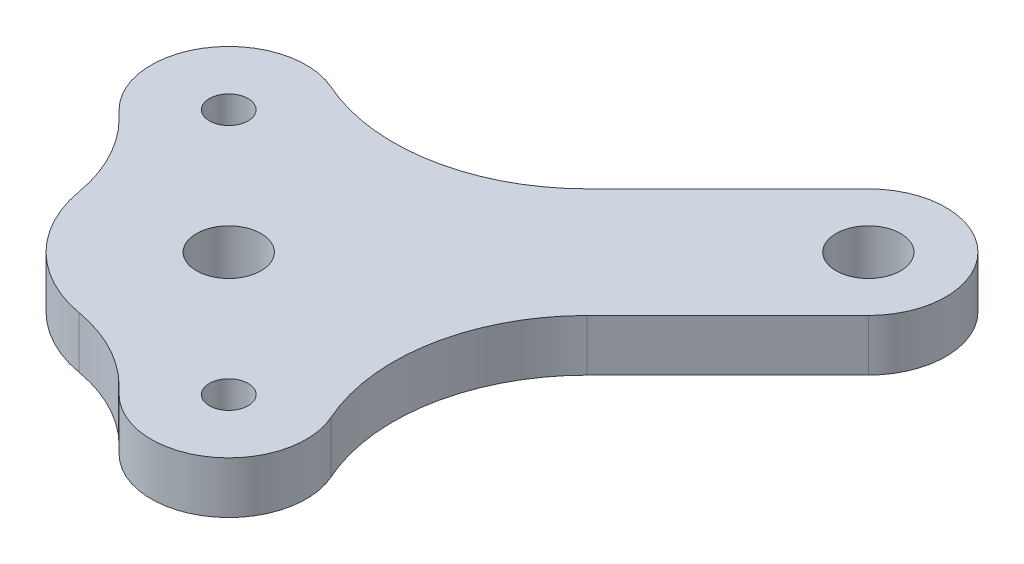
ISO-10303-21;
HEADER;
FILE_DESCRIPTION(('STEP AP214'),'2;1');
FILE_NAME('part.step','',(''),(''),'','','');
FILE_SCHEMA(('AUTOMOTIVE_DESIGN { 1 0 10303 214 1 1 1 1 }'));
ENDSEC;
DATA;
#1=APPLICATION_CONTEXT('core data for automotive mechanical design processes');
#2=APPLICATION_PROTOCOL_DEFINITION('international standard','automotive_design',2000,#1);
#3=PRODUCT_CONTEXT('',#1,'mechanical');
#4=PRODUCT('Part','Part','',(#3));
#5=PRODUCT_RELATED_PRODUCT_CATEGORY('part','',(#4));
#6=PRODUCT_DEFINITION_FORMATION('','',#4);
#7=PRODUCT_DEFINITION_CONTEXT('part definition',#1,'design');
#8=PRODUCT_DEFINITION('design','',#6,#7);
#9=PRODUCT_DEFINITION_SHAPE('','',#8);
#10=(LENGTH_UNIT() NAMED_UNIT(*) SI_UNIT(.MILLI.,.METRE.));
#11=(NAMED_UNIT(*) PLANE_ANGLE_UNIT() SI_UNIT($,.RADIAN.));
#12=(NAMED_UNIT(*) SI_UNIT($,.STERADIAN.) SOLID_ANGLE_UNIT());
#13=UNCERTAINTY_MEASURE_WITH_UNIT(LENGTH_MEASURE(1.E-05),#10,'distance_accuracy_value','');
#14=(GEOMETRIC_REPRESENTATION_CONTEXT(3) GLOBAL_UNCERTAINTY_ASSIGNED_CONTEXT((#13)) GLOBAL_UNIT_ASSIGNED_CONTEXT((#10,
#11,#12)) REPRESENTATION_CONTEXT('',''));
#15=CARTESIAN_POINT('',(0.,0.,0.));
#16=DIRECTION('',(0.,0.,1.));
#17=DIRECTION('',(1.,0.,0.));
#18=AXIS2_PLACEMENT_3D('',#15,#16,#17);
#19=CARTESIAN_POINT('',(17.9540584539815,31.5,60.4540584539817));
#20=DIRECTION('',(0.,1.,0.));
#21=DIRECTION('',(0.,0.,1.));
#22=AXIS2_PLACEMENT_3D('',#19,#20,#21);
#23=PLANE('',#22);
#24=CARTESIAN_POINT('',(52.248737341529,31.5,45.2512626584706));
#25=DIRECTION('',(0.,1.,0.));
#26=DIRECTION('',(0.,0.,1.));
#27=AXIS2_PLACEMENT_3D('',#24,#25,#26);
#28=CIRCLE('',#27,2.5);
#29=CARTESIAN_POINT('',(52.248737341529,31.5,47.7512626584706));
#30=VERTEX_POINT('',#29);
#31=EDGE_CURVE('E422',#30,#30,#28,.T.);
#32=ORIENTED_EDGE('',*,*,#31,.F.);
#33=EDGE_LOOP('',(#32));
#34=FACE_BOUND('',#33,.T.);
#35=CARTESIAN_POINT('',(17.9540584539815,31.5,60.4540584539817));
#36=DIRECTION('',(0.,1.,0.));
#37=DIRECTION('',(0.,0.,1.));
#38=AXIS2_PLACEMENT_3D('',#35,#36,#37);
#39=CIRCLE('',#38,1.49999999999998);
#40=CARTESIAN_POINT('',(17.9540584539815,31.5,61.9540584539817));
#41=VERTEX_POINT('',#40);
#42=EDGE_CURVE('E202',#41,#41,#39,.T.);
#43=ORIENTED_EDGE('',*,*,#42,.F.);
#44=EDGE_LOOP('',(#43));
#45=FACE_BOUND('',#44,.T.);
#46=CARTESIAN_POINT('',(17.9540584539815,31.5,60.4540584539817));
#47=DIRECTION('',(0.,1.,0.));
#48=DIRECTION('',(0.,0.,1.));
#49=AXIS2_PLACEMENT_3D('',#46,#47,#48);
#50=CIRCLE('',#49,6.00000000000009);
#51=CARTESIAN_POINT('',(20.4016672104904,31.5,54.9759920638161));
#52=VERTEX_POINT('',#51);
#53=CARTESIAN_POINT('',(13.7114177668622,31.5,64.6966991411011));
#54=VERTEX_POINT('',#53);
#55=EDGE_CURVE('E134',#52,#54,#50,.T.);
#56=ORIENTED_EDGE('',*,*,#55,.T.);
#57=DIRECTION('',(0.707106781186554,0.,0.707106781186541));
#58=VECTOR('',#57,1.);
#59=CARTESIAN_POINT('',(13.7114177668622,31.5,64.6966991411011));
#60=LINE('',#59,#58);
#61=CARTESIAN_POINT('',(14.3130874028816,31.5,65.2983687771204));
#62=VERTEX_POINT('',#61);
#63=EDGE_CURVE('E123',#54,#62,#60,.T.);
#64=ORIENTED_EDGE('',*,*,#63,.T.);
#65=CARTESIAN_POINT('',(5.82780602864306,31.5,73.7836501513591));
#66=DIRECTION('',(0.,1.,0.));
#67=DIRECTION('',(0.,0.,1.));
#68=AXIS2_PLACEMENT_3D('',#65,#66,#67);
#69=CIRCLE('',#68,12.);
#70=CARTESIAN_POINT('',(17.6490027402923,31.5,71.7198409778905));
#71=VERTEX_POINT('',#70);
#72=EDGE_CURVE('E165',#62,#71,#69,.F.);
#73=ORIENTED_EDGE('',*,*,#72,.T.);
#74=CARTESIAN_POINT('',(27.5,31.5,70.));
#75=DIRECTION('',(0.,1.,0.));
#76=DIRECTION('',(0.,0.,1.));
#77=AXIS2_PLACEMENT_3D('',#74,#75,#76);
#78=CIRCLE('',#77,9.99999999999999);
#79=CARTESIAN_POINT('',(25.7801590221097,31.5,79.8509972597077));
#80=VERTEX_POINT('',#79);
#81=EDGE_CURVE('E133',#71,#80,#78,.T.);
#82=ORIENTED_EDGE('',*,*,#81,.T.);
#83=CARTESIAN_POINT('',(23.7163498486414,31.5,91.672193971357));
#84=DIRECTION('',(0.,1.,0.));
#85=DIRECTION('',(0.,0.,1.));
#86=AXIS2_PLACEMENT_3D('',#83,#84,#85);
#87=CIRCLE('',#86,12.);
#88=CARTESIAN_POINT('',(32.2016312228799,31.5,83.1869125971184));
#89=VERTEX_POINT('',#88);
#90=EDGE_CURVE('E11',#80,#89,#87,.F.);
#91=ORIENTED_EDGE('',*,*,#90,.T.);
#92=DIRECTION('',(0.707106781186554,0.,0.707106781186541));
#93=VECTOR('',#92,1.);
#94=CARTESIAN_POINT('',(28.9142135623731,31.5,79.8994949366117));
#95=LINE('',#94,#93);
#96=CARTESIAN_POINT('',(32.8033008588992,31.5,83.7885822331377));
#97=VERTEX_POINT('',#96);
#98=EDGE_CURVE('E184',#89,#97,#95,.T.);
#99=ORIENTED_EDGE('',*,*,#98,.T.);
#100=CARTESIAN_POINT('',(37.0459415460185,31.5,79.5459415460183));
#101=DIRECTION('',(0.,1.,0.));
#102=DIRECTION('',(0.,0.,-1.));
#103=AXIS2_PLACEMENT_3D('',#100,#101,#102);
#104=CIRCLE('',#103,6.00000000000009);
#105=CARTESIAN_POINT('',(42.5240079361841,31.5,77.0983327895093));
#106=VERTEX_POINT('',#105);
#107=EDGE_CURVE('E186',#97,#106,#104,.T.);
#108=ORIENTED_EDGE('',*,*,#107,.T.);
#109=CARTESIAN_POINT('',(56.2191739115978,31.5,70.979310898237));
#110=DIRECTION('',(0.,-1.,0.));
#111=DIRECTION('',(0.,0.,-1.));
#112=AXIS2_PLACEMENT_3D('',#109,#110,#111);
#113=CIRCLE('',#112,15.);
#114=CARTESIAN_POINT('',(45.6125721937995,31.5,60.3727091804389));
#115=VERTEX_POINT('',#114);
#116=EDGE_CURVE('E188',#106,#115,#113,.T.);
#117=ORIENTED_EDGE('',*,*,#116,.T.);
#118=DIRECTION('',(0.707106781186541,0.,-0.707106781186554));
#119=VECTOR('',#118,1.);
#120=CARTESIAN_POINT('',(56.4913780286483,31.5,49.4939033455898));
#121=LINE('',#120,#119);
#122=CARTESIAN_POINT('',(56.4913780286483,31.5,49.4939033455898));
#123=VERTEX_POINT('',#122);
#124=EDGE_CURVE('E193',#115,#123,#121,.T.);
#125=ORIENTED_EDGE('',*,*,#124,.T.);
#126=CARTESIAN_POINT('',(52.248737341529,31.5,45.2512626584706));
#127=DIRECTION('',(0.,1.,0.));
#128=DIRECTION('',(0.,0.,1.));
#129=AXIS2_PLACEMENT_3D('',#126,#127,#128);
#130=CIRCLE('',#129,6.);
#131=CARTESIAN_POINT('',(48.0060966544097,31.5,41.0086219713513));
#132=VERTEX_POINT('',#131);
#133=EDGE_CURVE('E195',#123,#132,#130,.T.);
#134=ORIENTED_EDGE('',*,*,#133,.T.);
#135=DIRECTION('',(-0.707106781186541,0.,0.707106781186554));
#136=VECTOR('',#135,1.);
#137=CARTESIAN_POINT('',(48.0060966544097,31.5,41.0086219713513));
#138=LINE('',#137,#136);
#139=CARTESIAN_POINT('',(37.1272908195608,31.5,51.8874278062004));
#140=VERTEX_POINT('',#139);
#141=EDGE_CURVE('E197',#132,#140,#138,.T.);
#142=ORIENTED_EDGE('',*,*,#141,.T.);
#143=CARTESIAN_POINT('',(26.5206891017625,31.5,41.2808260884022));
#144=DIRECTION('',(0.,-1.,0.));
#145=DIRECTION('',(0.,0.,1.));
#146=AXIS2_PLACEMENT_3D('',#143,#144,#145);
#147=CIRCLE('',#146,15.);
#148=EDGE_CURVE('E139',#140,#52,#147,.T.);
#149=ORIENTED_EDGE('',*,*,#148,.T.);
#150=EDGE_LOOP('',(#56,#64,#73,#82,#91,#99,#108,#117,#125,#134,#142,#149));
#151=FACE_BOUND('',#150,.T.);
#152=CARTESIAN_POINT('',(27.5,31.5,70.));
#153=DIRECTION('',(0.,1.,0.));
#154=DIRECTION('',(0.,0.,1.));
#155=AXIS2_PLACEMENT_3D('',#152,#153,#154);
#156=CIRCLE('',#155,2.5);
#157=CARTESIAN_POINT('',(27.5,31.5,72.5));
#158=VERTEX_POINT('',#157);
#159=EDGE_CURVE('E428',#158,#158,#156,.T.);
#160=ORIENTED_EDGE('',*,*,#159,.F.);
#161=EDGE_LOOP('',(#160));
#162=FACE_BOUND('',#161,.T.);
#163=CARTESIAN_POINT('',(37.0459415460185,31.5,79.5459415460183));
#164=DIRECTION('',(0.,1.,0.));
#165=DIRECTION('',(0.,0.,-1.));
#166=AXIS2_PLACEMENT_3D('',#163,#164,#165);
#167=CIRCLE('',#166,1.5);
#168=CARTESIAN_POINT('',(37.0459415460185,31.5,78.0459415460183));
#169=VERTEX_POINT('',#168);
#170=EDGE_CURVE('E413',#169,#169,#167,.T.);
#171=ORIENTED_EDGE('',*,*,#170,.F.);
#172=EDGE_LOOP('',(#171));
#173=FACE_BOUND('',#172,.T.);
#174=ADVANCED_FACE('F35',(#34,#45,#151,#162,#173),#23,.T.);
#175=CARTESIAN_POINT('',(17.9540584539815,27.5,60.4540584539817));
#176=DIRECTION('',(0.,1.,0.));
#177=DIRECTION('',(0.,0.,1.));
#178=AXIS2_PLACEMENT_3D('',#175,#176,#177);
#179=PLANE('',#178);
#180=CARTESIAN_POINT('',(17.9540584539815,27.5,60.4540584539817));
#181=DIRECTION('',(0.,1.,0.));
#182=DIRECTION('',(0.,0.,1.));
#183=AXIS2_PLACEMENT_3D('',#180,#181,#182);
#184=CIRCLE('',#183,6.00000000000009);
#185=CARTESIAN_POINT('',(20.4016672104904,27.5,54.9759920638161));
#186=VERTEX_POINT('',#185);
#187=CARTESIAN_POINT('',(13.7114177668622,27.5,64.6966991411011));
#188=VERTEX_POINT('',#187);
#189=EDGE_CURVE('E147',#186,#188,#184,.T.);
#190=ORIENTED_EDGE('',*,*,#189,.F.);
#191=CARTESIAN_POINT('',(26.5206891017625,27.5,41.2808260884022));
#192=DIRECTION('',(0.,-1.,0.));
#193=DIRECTION('',(0.,0.,1.));
#194=AXIS2_PLACEMENT_3D('',#191,#192,#193);
#195=CIRCLE('',#194,15.);
#196=CARTESIAN_POINT('',(37.1272908195608,27.5,51.8874278062004));
#197=VERTEX_POINT('',#196);
#198=EDGE_CURVE('E143',#197,#186,#195,.T.);
#199=ORIENTED_EDGE('',*,*,#198,.F.);
#200=DIRECTION('',(-0.707106781186541,0.,0.707106781186554));
#201=VECTOR('',#200,1.);
#202=CARTESIAN_POINT('',(48.0060966544097,27.5,41.0086219713513));
#203=LINE('',#202,#201);
#204=CARTESIAN_POINT('',(48.0060966544097,27.5,41.0086219713513));
#205=VERTEX_POINT('',#204);
#206=EDGE_CURVE('E213',#205,#197,#203,.T.);
#207=ORIENTED_EDGE('',*,*,#206,.F.);
#208=CARTESIAN_POINT('',(52.248737341529,27.5,45.2512626584706));
#209=DIRECTION('',(0.,1.,0.));
#210=DIRECTION('',(0.,0.,1.));
#211=AXIS2_PLACEMENT_3D('',#208,#209,#210);
#212=CIRCLE('',#211,6.);
#213=CARTESIAN_POINT('',(56.4913780286483,27.5,49.4939033455898));
#214=VERTEX_POINT('',#213);
#215=EDGE_CURVE('E211',#214,#205,#212,.T.);
#216=ORIENTED_EDGE('',*,*,#215,.F.);
#217=DIRECTION('',(0.707106781186541,0.,-0.707106781186554));
#218=VECTOR('',#217,1.);
#219=CARTESIAN_POINT('',(56.4913780286483,27.5,49.4939033455898));
#220=LINE('',#219,#218);
#221=CARTESIAN_POINT('',(45.6125721937995,27.5,60.3727091804389));
#222=VERTEX_POINT('',#221);
#223=EDGE_CURVE('E209',#222,#214,#220,.T.);
#224=ORIENTED_EDGE('',*,*,#223,.F.);
#225=CARTESIAN_POINT('',(56.2191739115978,27.5,70.979310898237));
#226=DIRECTION('',(0.,-1.,0.));
#227=DIRECTION('',(0.,0.,-1.));
#228=AXIS2_PLACEMENT_3D('',#225,#226,#227);
#229=CIRCLE('',#228,15.);
#230=CARTESIAN_POINT('',(42.5240079361841,27.5,77.0983327895093));
#231=VERTEX_POINT('',#230);
#232=EDGE_CURVE('E207',#231,#222,#229,.T.);
#233=ORIENTED_EDGE('',*,*,#232,.F.);
#234=CARTESIAN_POINT('',(37.0459415460185,27.5,79.5459415460183));
#235=DIRECTION('',(0.,1.,0.));
#236=DIRECTION('',(0.,0.,-1.));
#237=AXIS2_PLACEMENT_3D('',#234,#235,#236);
#238=CIRCLE('',#237,6.00000000000009);
#239=CARTESIAN_POINT('',(32.8033008588992,27.5,83.7885822331377));
#240=VERTEX_POINT('',#239);
#241=EDGE_CURVE('E205',#240,#231,#238,.T.);
#242=ORIENTED_EDGE('',*,*,#241,.F.);
#243=DIRECTION('',(0.707106781186554,0.,0.707106781186541));
#244=VECTOR('',#243,1.);
#245=CARTESIAN_POINT('',(28.9142135623731,27.5,79.8994949366117));
#246=LINE('',#245,#244);
#247=CARTESIAN_POINT('',(32.2016312228799,27.5,83.1869125971184));
#248=VERTEX_POINT('',#247);
#249=EDGE_CURVE('E174',#248,#240,#246,.T.);
#250=ORIENTED_EDGE('',*,*,#249,.F.);
#251=CARTESIAN_POINT('',(23.7163498486414,27.5,91.672193971357));
#252=DIRECTION('',(0.,1.,0.));
#253=DIRECTION('',(0.,0.,1.));
#254=AXIS2_PLACEMENT_3D('',#251,#252,#253);
#255=CIRCLE('',#254,12.);
#256=CARTESIAN_POINT('',(25.7801590221097,27.5,79.8509972597077));
#257=VERTEX_POINT('',#256);
#258=EDGE_CURVE('E43',#248,#257,#255,.T.);
#259=ORIENTED_EDGE('',*,*,#258,.T.);
#260=CARTESIAN_POINT('',(27.5,27.5,70.));
#261=DIRECTION('',(0.,1.,0.));
#262=DIRECTION('',(0.,0.,1.));
#263=AXIS2_PLACEMENT_3D('',#260,#261,#262);
#264=CIRCLE('',#263,9.99999999999999);
#265=CARTESIAN_POINT('',(17.6490027402923,27.5,71.7198409778905));
#266=VERTEX_POINT('',#265);
#267=EDGE_CURVE('E172',#266,#257,#264,.T.);
#268=ORIENTED_EDGE('',*,*,#267,.F.);
#269=CARTESIAN_POINT('',(5.82780602864306,27.5,73.7836501513591));
#270=DIRECTION('',(0.,1.,0.));
#271=DIRECTION('',(0.,0.,1.));
#272=AXIS2_PLACEMENT_3D('',#269,#270,#271);
#273=CIRCLE('',#272,12.);
#274=CARTESIAN_POINT('',(14.3130874028816,27.5,65.2983687771204));
#275=VERTEX_POINT('',#274);
#276=EDGE_CURVE('E163',#266,#275,#273,.T.);
#277=ORIENTED_EDGE('',*,*,#276,.T.);
#278=DIRECTION('',(0.707106781186554,0.,0.707106781186541));
#279=VECTOR('',#278,1.);
#280=CARTESIAN_POINT('',(13.7114177668622,27.5,64.6966991411011));
#281=LINE('',#280,#279);
#282=EDGE_CURVE('E179',#188,#275,#281,.T.);
#283=ORIENTED_EDGE('',*,*,#282,.F.);
#284=EDGE_LOOP('',(#190,#199,#207,#216,#224,#233,#242,#250,#259,#268,#277,#283));
#285=FACE_BOUND('',#284,.T.);
#286=CARTESIAN_POINT('',(17.9540584539815,27.5,60.4540584539817));
#287=DIRECTION('',(0.,1.,0.));
#288=DIRECTION('',(0.,0.,1.));
#289=AXIS2_PLACEMENT_3D('',#286,#287,#288);
#290=CIRCLE('',#289,1.49999999999998);
#291=CARTESIAN_POINT('',(17.9540584539815,27.5,61.9540584539817));
#292=VERTEX_POINT('',#291);
#293=EDGE_CURVE('E431',#292,#292,#290,.T.);
#294=ORIENTED_EDGE('',*,*,#293,.T.);
#295=EDGE_LOOP('',(#294));
#296=FACE_BOUND('',#295,.T.);
#297=CARTESIAN_POINT('',(27.5,27.5,70.));
#298=DIRECTION('',(0.,1.,0.));
#299=DIRECTION('',(0.,0.,1.));
#300=AXIS2_PLACEMENT_3D('',#297,#298,#299);
#301=CIRCLE('',#300,2.5);
#302=CARTESIAN_POINT('',(27.5,27.5,72.5));
#303=VERTEX_POINT('',#302);
#304=EDGE_CURVE('E425',#303,#303,#301,.T.);
#305=ORIENTED_EDGE('',*,*,#304,.T.);
#306=EDGE_LOOP('',(#305));
#307=FACE_BOUND('',#306,.T.);
#308=CARTESIAN_POINT('',(52.248737341529,27.5,45.2512626584706));
#309=DIRECTION('',(0.,1.,0.));
#310=DIRECTION('',(0.,0.,1.));
#311=AXIS2_PLACEMENT_3D('',#308,#309,#310);
#312=CIRCLE('',#311,2.5);
#313=CARTESIAN_POINT('',(52.248737341529,27.5,47.7512626584706));
#314=VERTEX_POINT('',#313);
#315=EDGE_CURVE('E419',#314,#314,#312,.T.);
#316=ORIENTED_EDGE('',*,*,#315,.T.);
#317=EDGE_LOOP('',(#316));
#318=FACE_BOUND('',#317,.T.);
#319=CARTESIAN_POINT('',(37.0459415460185,27.5,79.5459415460183));
#320=DIRECTION('',(0.,1.,0.));
#321=DIRECTION('',(0.,0.,-1.));
#322=AXIS2_PLACEMENT_3D('',#319,#320,#321);
#323=CIRCLE('',#322,1.5);
#324=CARTESIAN_POINT('',(37.0459415460185,27.5,78.0459415460183));
#325=VERTEX_POINT('',#324);
#326=EDGE_CURVE('E416',#325,#325,#323,.T.);
#327=ORIENTED_EDGE('',*,*,#326,.T.);
#328=EDGE_LOOP('',(#327));
#329=FACE_BOUND('',#328,.T.);
#330=ADVANCED_FACE('F170',(#285,#296,#307,#318,#329),#179,.F.);
#331=CARTESIAN_POINT('',(17.9540584539815,31.5,60.4540584539817));
#332=DIRECTION('',(0.,-1.,0.));
#333=DIRECTION('',(0.,0.,-1.));
#334=AXIS2_PLACEMENT_3D('',#331,#332,#333);
#335=CYLINDRICAL_SURFACE('',#334,6.00000000000009);
#336=ORIENTED_EDGE('',*,*,#189,.T.);
#337=DIRECTION('',(0.,-1.,0.));
#338=VECTOR('',#337,1.);
#339=CARTESIAN_POINT('',(13.7114177668622,31.5,64.6966991411011));
#340=LINE('',#339,#338);
#341=EDGE_CURVE('E128',#54,#188,#340,.T.);
#342=ORIENTED_EDGE('',*,*,#341,.F.);
#343=ORIENTED_EDGE('',*,*,#55,.F.);
#344=DIRECTION('',(0.,-1.,0.));
#345=VECTOR('',#344,1.);
#346=CARTESIAN_POINT('',(20.4016672104904,31.5,54.9759920638161));
#347=LINE('',#346,#345);
#348=EDGE_CURVE('E200',#52,#186,#347,.T.);
#349=ORIENTED_EDGE('',*,*,#348,.T.);
#350=EDGE_LOOP('',(#336,#342,#343,#349));
#351=FACE_BOUND('',#350,.T.);
#352=ADVANCED_FACE('F145',(#351),#335,.T.);
#353=CARTESIAN_POINT('',(13.7114177668622,31.5,64.6966991411011));
#354=DIRECTION('',(0.707106781186541,0.,-0.707106781186554));
#355=DIRECTION('',(-0.707106781186554,0.,-0.707106781186541));
#356=AXIS2_PLACEMENT_3D('',#353,#354,#355);
#357=PLANE('',#356);
#358=ORIENTED_EDGE('',*,*,#282,.T.);
#359=DIRECTION('',(0.,1.,0.));
#360=VECTOR('',#359,1.);
#361=CARTESIAN_POINT('',(14.3130874028816,31.5,65.2983687771204));
#362=LINE('',#361,#360);
#363=EDGE_CURVE('E131',#275,#62,#362,.T.);
#364=ORIENTED_EDGE('',*,*,#363,.T.);
#365=ORIENTED_EDGE('',*,*,#63,.F.);
#366=ORIENTED_EDGE('',*,*,#341,.T.);
#367=EDGE_LOOP('',(#358,#364,#365,#366));
#368=FACE_BOUND('',#367,.T.);
#369=ADVANCED_FACE('F126',(#368),#357,.F.);
#370=CARTESIAN_POINT('',(27.5,31.5,70.));
#371=DIRECTION('',(0.,-1.,0.));
#372=DIRECTION('',(0.,0.,-1.));
#373=AXIS2_PLACEMENT_3D('',#370,#371,#372);
#374=CYLINDRICAL_SURFACE('',#373,9.99999999999999);
#375=ORIENTED_EDGE('',*,*,#81,.F.);
#376=DIRECTION('',(0.,-1.,0.));
#377=VECTOR('',#376,1.);
#378=CARTESIAN_POINT('',(17.6490027402923,31.5,71.7198409778905));
#379=LINE('',#378,#377);
#380=EDGE_CURVE('E151',#71,#266,#379,.T.);
#381=ORIENTED_EDGE('',*,*,#380,.T.);
#382=ORIENTED_EDGE('',*,*,#267,.T.);
#383=DIRECTION('',(0.,-1.,0.));
#384=VECTOR('',#383,1.);
#385=CARTESIAN_POINT('',(25.7801590221097,31.5,79.8509972597077));
#386=LINE('',#385,#384);
#387=EDGE_CURVE('E148',#257,#80,#386,.F.);
#388=ORIENTED_EDGE('',*,*,#387,.T.);
#389=EDGE_LOOP('',(#375,#381,#382,#388));
#390=FACE_BOUND('',#389,.T.);
#391=ADVANCED_FACE('F177',(#390),#374,.T.);
#392=CARTESIAN_POINT('',(28.9142135623731,31.5,79.8994949366117));
#393=DIRECTION('',(0.707106781186541,0.,-0.707106781186554));
#394=DIRECTION('',(-0.707106781186554,0.,-0.707106781186541));
#395=AXIS2_PLACEMENT_3D('',#392,#393,#394);
#396=PLANE('',#395);
#397=ORIENTED_EDGE('',*,*,#98,.F.);
#398=DIRECTION('',(0.,1.,0.));
#399=VECTOR('',#398,1.);
#400=CARTESIAN_POINT('',(32.2016312228799,27.5,83.1869125971184));
#401=LINE('',#400,#399);
#402=EDGE_CURVE('E161',#89,#248,#401,.F.);
#403=ORIENTED_EDGE('',*,*,#402,.T.);
#404=ORIENTED_EDGE('',*,*,#249,.T.);
#405=DIRECTION('',(0.,-1.,0.));
#406=VECTOR('',#405,1.);
#407=CARTESIAN_POINT('',(32.8033008588992,31.5,83.7885822331377));
#408=LINE('',#407,#406);
#409=EDGE_CURVE('E149',#97,#240,#408,.T.);
#410=ORIENTED_EDGE('',*,*,#409,.F.);
#411=EDGE_LOOP('',(#397,#403,#404,#410));
#412=FACE_BOUND('',#411,.T.);
#413=ADVANCED_FACE('F182',(#412),#396,.F.);
#414=CARTESIAN_POINT('',(37.0459415460185,31.5,79.5459415460183));
#415=DIRECTION('',(0.,-1.,0.));
#416=DIRECTION('',(0.,0.,-1.));
#417=AXIS2_PLACEMENT_3D('',#414,#415,#416);
#418=CYLINDRICAL_SURFACE('',#417,6.00000000000009);
#419=ORIENTED_EDGE('',*,*,#241,.T.);
#420=DIRECTION('',(0.,-1.,0.));
#421=VECTOR('',#420,1.);
#422=CARTESIAN_POINT('',(42.5240079361841,31.5,77.0983327895093));
#423=LINE('',#422,#421);
#424=EDGE_CURVE('E154',#106,#231,#423,.T.);
#425=ORIENTED_EDGE('',*,*,#424,.F.);
#426=ORIENTED_EDGE('',*,*,#107,.F.);
#427=ORIENTED_EDGE('',*,*,#409,.T.);
#428=EDGE_LOOP('',(#419,#425,#426,#427));
#429=FACE_BOUND('',#428,.T.);
#430=ADVANCED_FACE('F249',(#429),#418,.T.);
#431=CARTESIAN_POINT('',(56.2191739115978,31.5,70.979310898237));
#432=DIRECTION('',(0.,-1.,0.));
#433=DIRECTION('',(0.,0.,-1.));
#434=AXIS2_PLACEMENT_3D('',#431,#432,#433);
#435=CYLINDRICAL_SURFACE('',#434,15.);
#436=ORIENTED_EDGE('',*,*,#232,.T.);
#437=DIRECTION('',(0.,-1.,0.));
#438=VECTOR('',#437,1.);
#439=CARTESIAN_POINT('',(45.6125721937995,31.5,60.3727091804389));
#440=LINE('',#439,#438);
#441=EDGE_CURVE('E226',#115,#222,#440,.T.);
#442=ORIENTED_EDGE('',*,*,#441,.F.);
#443=ORIENTED_EDGE('',*,*,#116,.F.);
#444=ORIENTED_EDGE('',*,*,#424,.T.);
#445=EDGE_LOOP('',(#436,#442,#443,#444));
#446=FACE_BOUND('',#445,.T.);
#447=ADVANCED_FACE('F233',(#446),#435,.F.);
#448=CARTESIAN_POINT('',(56.4913780286483,31.5,49.4939033455898));
#449=DIRECTION('',(-0.707106781186554,0.,-0.707106781186541));
#450=DIRECTION('',(-0.707106781186541,0.,0.707106781186554));
#451=AXIS2_PLACEMENT_3D('',#448,#449,#450);
#452=PLANE('',#451);
#453=ORIENTED_EDGE('',*,*,#223,.T.);
#454=DIRECTION('',(0.,-1.,0.));
#455=VECTOR('',#454,1.);
#456=CARTESIAN_POINT('',(56.4913780286483,31.5,49.4939033455898));
#457=LINE('',#456,#455);
#458=EDGE_CURVE('E223',#123,#214,#457,.T.);
#459=ORIENTED_EDGE('',*,*,#458,.F.);
#460=ORIENTED_EDGE('',*,*,#124,.F.);
#461=ORIENTED_EDGE('',*,*,#441,.T.);
#462=EDGE_LOOP('',(#453,#459,#460,#461));
#463=FACE_BOUND('',#462,.T.);
#464=ADVANCED_FACE('F241',(#463),#452,.F.);
#465=CARTESIAN_POINT('',(52.248737341529,31.5,45.2512626584706));
#466=DIRECTION('',(0.,-1.,0.));
#467=DIRECTION('',(0.,0.,-1.));
#468=AXIS2_PLACEMENT_3D('',#465,#466,#467);
#469=CYLINDRICAL_SURFACE('',#468,6.);
#470=ORIENTED_EDGE('',*,*,#215,.T.);
#471=DIRECTION('',(0.,-1.,0.));
#472=VECTOR('',#471,1.);
#473=CARTESIAN_POINT('',(48.0060966544097,31.5,41.0086219713513));
#474=LINE('',#473,#472);
#475=EDGE_CURVE('E220',#132,#205,#474,.T.);
#476=ORIENTED_EDGE('',*,*,#475,.F.);
#477=ORIENTED_EDGE('',*,*,#133,.F.);
#478=ORIENTED_EDGE('',*,*,#458,.T.);
#479=EDGE_LOOP('',(#470,#476,#477,#478));
#480=FACE_BOUND('',#479,.T.);
#481=ADVANCED_FACE('F245',(#480),#469,.T.);
#482=CARTESIAN_POINT('',(48.0060966544097,31.5,41.0086219713513));
#483=DIRECTION('',(0.707106781186554,0.,0.707106781186541));
#484=DIRECTION('',(0.707106781186541,0.,-0.707106781186554));
#485=AXIS2_PLACEMENT_3D('',#482,#483,#484);
#486=PLANE('',#485);
#487=ORIENTED_EDGE('',*,*,#206,.T.);
#488=DIRECTION('',(0.,-1.,0.));
#489=VECTOR('',#488,1.);
#490=CARTESIAN_POINT('',(37.1272908195608,31.5,51.8874278062004));
#491=LINE('',#490,#489);
#492=EDGE_CURVE('E217',#140,#197,#491,.T.);
#493=ORIENTED_EDGE('',*,*,#492,.F.);
#494=ORIENTED_EDGE('',*,*,#141,.F.);
#495=ORIENTED_EDGE('',*,*,#475,.T.);
#496=EDGE_LOOP('',(#487,#493,#494,#495));
#497=FACE_BOUND('',#496,.T.);
#498=ADVANCED_FACE('F274',(#497),#486,.F.);
#499=CARTESIAN_POINT('',(26.5206891017625,31.5,41.2808260884022));
#500=DIRECTION('',(0.,-1.,0.));
#501=DIRECTION('',(0.,0.,-1.));
#502=AXIS2_PLACEMENT_3D('',#499,#500,#501);
#503=CYLINDRICAL_SURFACE('',#502,15.);
#504=ORIENTED_EDGE('',*,*,#198,.T.);
#505=ORIENTED_EDGE('',*,*,#348,.F.);
#506=ORIENTED_EDGE('',*,*,#148,.F.);
#507=ORIENTED_EDGE('',*,*,#492,.T.);
#508=EDGE_LOOP('',(#504,#505,#506,#507));
#509=FACE_BOUND('',#508,.T.);
#510=ADVANCED_FACE('F271',(#509),#503,.F.);
#511=CARTESIAN_POINT('',(17.9540584539815,31.5,60.4540584539817));
#512=DIRECTION('',(0.,-1.,0.));
#513=DIRECTION('',(0.,0.,-1.));
#514=AXIS2_PLACEMENT_3D('',#511,#512,#513);
#515=CYLINDRICAL_SURFACE('',#514,1.49999999999998);
#516=ORIENTED_EDGE('',*,*,#42,.T.);
#517=EDGE_LOOP('',(#516));
#518=FACE_BOUND('',#517,.T.);
#519=ORIENTED_EDGE('',*,*,#293,.F.);
#520=EDGE_LOOP('',(#519));
#521=FACE_BOUND('',#520,.T.);
#522=ADVANCED_FACE('F268',(#518,#521),#515,.F.);
#523=CARTESIAN_POINT('',(27.5,31.5,70.));
#524=DIRECTION('',(0.,-1.,0.));
#525=DIRECTION('',(0.,0.,-1.));
#526=AXIS2_PLACEMENT_3D('',#523,#524,#525);
#527=CYLINDRICAL_SURFACE('',#526,2.5);
#528=ORIENTED_EDGE('',*,*,#159,.T.);
#529=EDGE_LOOP('',(#528));
#530=FACE_BOUND('',#529,.T.);
#531=ORIENTED_EDGE('',*,*,#304,.F.);
#532=EDGE_LOOP('',(#531));
#533=FACE_BOUND('',#532,.T.);
#534=ADVANCED_FACE('F304',(#530,#533),#527,.F.);
#535=CARTESIAN_POINT('',(52.248737341529,31.5,45.2512626584706));
#536=DIRECTION('',(0.,-1.,0.));
#537=DIRECTION('',(0.,0.,-1.));
#538=AXIS2_PLACEMENT_3D('',#535,#536,#537);
#539=CYLINDRICAL_SURFACE('',#538,2.5);
#540=ORIENTED_EDGE('',*,*,#31,.T.);
#541=EDGE_LOOP('',(#540));
#542=FACE_BOUND('',#541,.T.);
#543=ORIENTED_EDGE('',*,*,#315,.F.);
#544=EDGE_LOOP('',(#543));
#545=FACE_BOUND('',#544,.T.);
#546=ADVANCED_FACE('F311',(#542,#545),#539,.F.);
#547=CARTESIAN_POINT('',(37.0459415460185,31.5,79.5459415460183));
#548=DIRECTION('',(0.,-1.,0.));
#549=DIRECTION('',(0.,0.,-1.));
#550=AXIS2_PLACEMENT_3D('',#547,#548,#549);
#551=CYLINDRICAL_SURFACE('',#550,1.5);
#552=ORIENTED_EDGE('',*,*,#170,.T.);
#553=EDGE_LOOP('',(#552));
#554=FACE_BOUND('',#553,.T.);
#555=ORIENTED_EDGE('',*,*,#326,.F.);
#556=EDGE_LOOP('',(#555));
#557=FACE_BOUND('',#556,.T.);
#558=ADVANCED_FACE('F318',(#554,#557),#551,.F.);
#559=CARTESIAN_POINT('',(5.82780602864306,31.5,73.7836501513591));
#560=DIRECTION('',(0.,-1.,0.));
#561=DIRECTION('',(0.,0.,-1.));
#562=AXIS2_PLACEMENT_3D('',#559,#560,#561);
#563=CYLINDRICAL_SURFACE('',#562,12.);
#564=ORIENTED_EDGE('',*,*,#72,.F.);
#565=ORIENTED_EDGE('',*,*,#363,.F.);
#566=ORIENTED_EDGE('',*,*,#276,.F.);
#567=ORIENTED_EDGE('',*,*,#380,.F.);
#568=EDGE_LOOP('',(#564,#565,#566,#567));
#569=FACE_BOUND('',#568,.T.);
#570=ADVANCED_FACE('F326',(#569),#563,.F.);
#571=CARTESIAN_POINT('',(23.7163498486414,31.5,91.672193971357));
#572=DIRECTION('',(0.,-1.,0.));
#573=DIRECTION('',(0.,0.,-1.));
#574=AXIS2_PLACEMENT_3D('',#571,#572,#573);
#575=CYLINDRICAL_SURFACE('',#574,12.);
#576=ORIENTED_EDGE('',*,*,#90,.F.);
#577=ORIENTED_EDGE('',*,*,#387,.F.);
#578=ORIENTED_EDGE('',*,*,#258,.F.);
#579=ORIENTED_EDGE('',*,*,#402,.F.);
#580=EDGE_LOOP('',(#576,#577,#578,#579));
#581=FACE_BOUND('',#580,.T.);
#582=ADVANCED_FACE('F37',(#581),#575,.F.);
#583=CLOSED_SHELL('',(#174,#330,#352,#369,#391,#413,#430,#447,#464,#481,#498,#510,#522,#534,
#546,#558,#570,#582));
#584=MANIFOLD_SOLID_BREP('B2',#583);
#585=ADVANCED_BREP_SHAPE_REPRESENTATION('',(#18,#584),#14);
#586=SHAPE_DEFINITION_REPRESENTATION(#9,#585);
ENDSEC;
END-ISO-10303-21;
